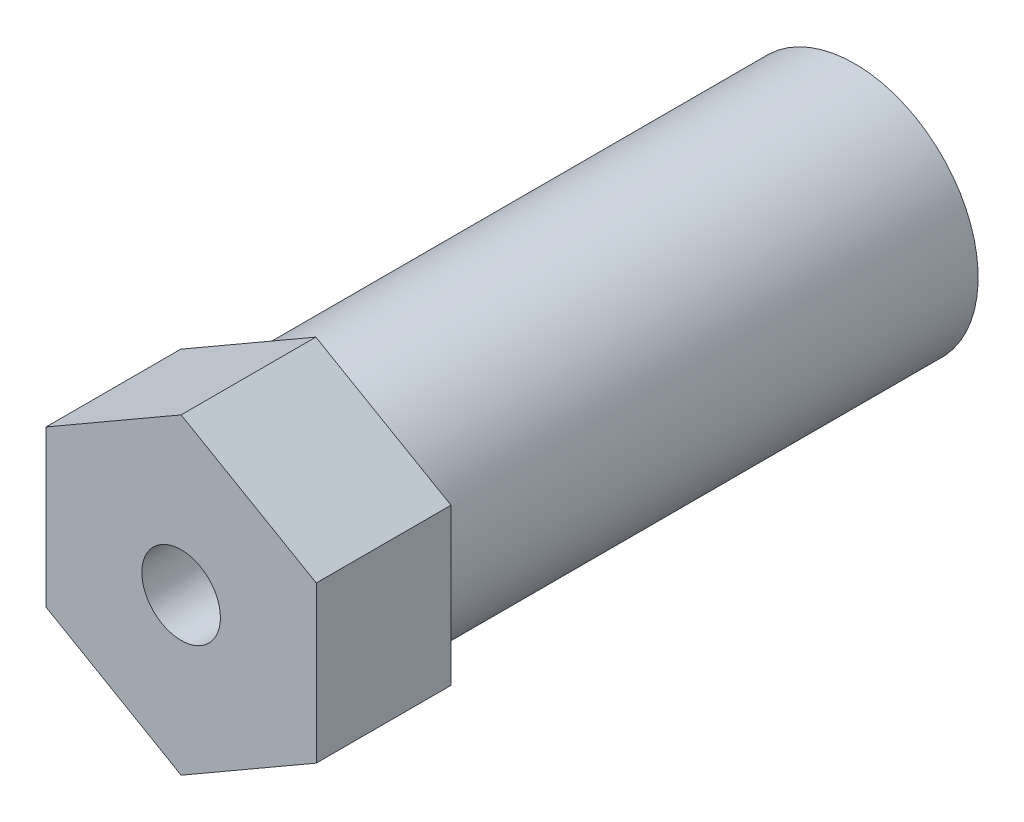
ISO-10303-21;
HEADER;
FILE_DESCRIPTION(('STEP AP214'),'2;1');
FILE_NAME('part.step','',(''),(''),'','','');
FILE_SCHEMA(('AUTOMOTIVE_DESIGN { 1 0 10303 214 1 1 1 1 }'));
ENDSEC;
DATA;
#1=APPLICATION_CONTEXT('core data for automotive mechanical design processes');
#2=APPLICATION_PROTOCOL_DEFINITION('international standard','automotive_design',2000,#1);
#3=PRODUCT_CONTEXT('',#1,'mechanical');
#4=PRODUCT('Part','Part','',(#3));
#5=PRODUCT_RELATED_PRODUCT_CATEGORY('part','',(#4));
#6=PRODUCT_DEFINITION_FORMATION('','',#4);
#7=PRODUCT_DEFINITION_CONTEXT('part definition',#1,'design');
#8=PRODUCT_DEFINITION('design','',#6,#7);
#9=PRODUCT_DEFINITION_SHAPE('','',#8);
#10=(LENGTH_UNIT() NAMED_UNIT(*) SI_UNIT(.MILLI.,.METRE.));
#11=(NAMED_UNIT(*) PLANE_ANGLE_UNIT() SI_UNIT($,.RADIAN.));
#12=(NAMED_UNIT(*) SI_UNIT($,.STERADIAN.) SOLID_ANGLE_UNIT());
#13=UNCERTAINTY_MEASURE_WITH_UNIT(LENGTH_MEASURE(1.E-05),#10,'distance_accuracy_value','');
#14=(GEOMETRIC_REPRESENTATION_CONTEXT(3) GLOBAL_UNCERTAINTY_ASSIGNED_CONTEXT((#13)) GLOBAL_UNIT_ASSIGNED_CONTEXT((#10,
#11,#12)) REPRESENTATION_CONTEXT('',''));
#15=CARTESIAN_POINT('',(0.,0.,0.));
#16=DIRECTION('',(0.,0.,1.));
#17=DIRECTION('',(1.,0.,0.));
#18=AXIS2_PLACEMENT_3D('',#15,#16,#17);
#19=CARTESIAN_POINT('',(0.,0.,0.));
#20=DIRECTION('',(0.,0.,1.));
#21=DIRECTION('',(1.,0.,0.));
#22=AXIS2_PLACEMENT_3D('',#19,#20,#21);
#23=PLANE('',#22);
#24=CARTESIAN_POINT('',(0.,0.,0.));
#25=DIRECTION('',(0.,0.,1.));
#26=DIRECTION('',(1.,0.,0.));
#27=AXIS2_PLACEMENT_3D('',#24,#25,#26);
#28=CIRCLE('',#27,1.75);
#29=CARTESIAN_POINT('',(1.75,0.,0.));
#30=VERTEX_POINT('',#29);
#31=EDGE_CURVE('E136',#30,#30,#28,.T.);
#32=ORIENTED_EDGE('',*,*,#31,.T.);
#33=EDGE_LOOP('',(#32));
#34=FACE_BOUND('',#33,.T.);
#35=CARTESIAN_POINT('',(0.,0.,0.));
#36=DIRECTION('',(0.,0.,-1.));
#37=DIRECTION('',(-1.,0.,0.));
#38=AXIS2_PLACEMENT_3D('',#35,#36,#37);
#39=CIRCLE('',#38,3.);
#40=CARTESIAN_POINT('',(-3.,0.,0.));
#41=VERTEX_POINT('',#40);
#42=EDGE_CURVE('E186',#41,#41,#39,.T.);
#43=ORIENTED_EDGE('',*,*,#42,.T.);
#44=EDGE_LOOP('',(#43));
#45=FACE_BOUND('',#44,.T.);
#46=ADVANCED_FACE('F39',(#34,#45),#23,.F.);
#47=CARTESIAN_POINT('',(6.01887655630181,3.47500000000007,6.));
#48=DIRECTION('',(-0.499999999999995,-0.866025403784441,0.));
#49=DIRECTION('',(0.866025403784441,-0.499999999999995,0.));
#50=AXIS2_PLACEMENT_3D('',#47,#48,#49);
#51=PLANE('',#50);
#52=DIRECTION('',(-0.866025403784441,0.499999999999995,0.));
#53=VECTOR('',#52,1.);
#54=CARTESIAN_POINT('',(6.01887655630181,3.47500000000007,0.));
#55=LINE('',#54,#53);
#56=CARTESIAN_POINT('',(6.01887655630181,3.47500000000007,0.));
#57=VERTEX_POINT('',#56);
#58=CARTESIAN_POINT('',(0.,6.95,0.));
#59=VERTEX_POINT('',#58);
#60=EDGE_CURVE('E131',#57,#59,#55,.T.);
#61=ORIENTED_EDGE('',*,*,#60,.T.);
#62=DIRECTION('',(0.,0.,-1.));
#63=VECTOR('',#62,1.);
#64=CARTESIAN_POINT('',(0.,6.95,6.));
#65=LINE('',#64,#63);
#66=CARTESIAN_POINT('',(0.,6.95,6.));
#67=VERTEX_POINT('',#66);
#68=EDGE_CURVE('E43',#67,#59,#65,.T.);
#69=ORIENTED_EDGE('',*,*,#68,.F.);
#70=DIRECTION('',(-0.866025403784441,0.499999999999995,0.));
#71=VECTOR('',#70,1.);
#72=CARTESIAN_POINT('',(6.01887655630181,3.47500000000007,6.));
#73=LINE('',#72,#71);
#74=CARTESIAN_POINT('',(6.01887655630181,3.47500000000007,6.));
#75=VERTEX_POINT('',#74);
#76=EDGE_CURVE('E148',#75,#67,#73,.T.);
#77=ORIENTED_EDGE('',*,*,#76,.F.);
#78=DIRECTION('',(0.,0.,-1.));
#79=VECTOR('',#78,1.);
#80=CARTESIAN_POINT('',(6.01887655630181,3.47500000000007,6.));
#81=LINE('',#80,#79);
#82=EDGE_CURVE('E127',#75,#57,#81,.T.);
#83=ORIENTED_EDGE('',*,*,#82,.T.);
#84=EDGE_LOOP('',(#61,#69,#77,#83));
#85=FACE_BOUND('',#84,.T.);
#86=ADVANCED_FACE('F41',(#85),#51,.F.);
#87=CARTESIAN_POINT('',(0.,6.95,6.));
#88=DIRECTION('',(0.500000000000001,-0.866025403784438,0.));
#89=DIRECTION('',(0.866025403784438,0.500000000000001,0.));
#90=AXIS2_PLACEMENT_3D('',#87,#88,#89);
#91=PLANE('',#90);
#92=DIRECTION('',(-0.866025403784438,-0.500000000000001,0.));
#93=VECTOR('',#92,1.);
#94=CARTESIAN_POINT('',(0.,6.95,0.));
#95=LINE('',#94,#93);
#96=CARTESIAN_POINT('',(-6.01887655630186,3.47499999999999,0.));
#97=VERTEX_POINT('',#96);
#98=EDGE_CURVE('E135',#59,#97,#95,.T.);
#99=ORIENTED_EDGE('',*,*,#98,.T.);
#100=DIRECTION('',(0.,0.,-1.));
#101=VECTOR('',#100,1.);
#102=CARTESIAN_POINT('',(-6.01887655630186,3.47499999999999,6.));
#103=LINE('',#102,#101);
#104=CARTESIAN_POINT('',(-6.01887655630186,3.47499999999999,6.));
#105=VERTEX_POINT('',#104);
#106=EDGE_CURVE('E154',#105,#97,#103,.T.);
#107=ORIENTED_EDGE('',*,*,#106,.F.);
#108=DIRECTION('',(-0.866025403784438,-0.500000000000001,0.));
#109=VECTOR('',#108,1.);
#110=CARTESIAN_POINT('',(0.,6.95,6.));
#111=LINE('',#110,#109);
#112=EDGE_CURVE('E96',#67,#105,#111,.T.);
#113=ORIENTED_EDGE('',*,*,#112,.F.);
#114=ORIENTED_EDGE('',*,*,#68,.T.);
#115=EDGE_LOOP('',(#99,#107,#113,#114));
#116=FACE_BOUND('',#115,.T.);
#117=ADVANCED_FACE('F161',(#116),#91,.F.);
#118=CARTESIAN_POINT('',(-6.01887655630186,3.47499999999999,6.));
#119=DIRECTION('',(1.,0.,0.));
#120=DIRECTION('',(0.,1.,0.));
#121=AXIS2_PLACEMENT_3D('',#118,#119,#120);
#122=PLANE('',#121);
#123=DIRECTION('',(0.,-1.,0.));
#124=VECTOR('',#123,1.);
#125=CARTESIAN_POINT('',(-6.01887655630186,3.47499999999999,0.));
#126=LINE('',#125,#124);
#127=CARTESIAN_POINT('',(-6.01887655630183,-3.47500000000003,0.));
#128=VERTEX_POINT('',#127);
#129=EDGE_CURVE('E139',#97,#128,#126,.T.);
#130=ORIENTED_EDGE('',*,*,#129,.T.);
#131=DIRECTION('',(0.,0.,-1.));
#132=VECTOR('',#131,1.);
#133=CARTESIAN_POINT('',(-6.01887655630183,-3.47500000000003,6.));
#134=LINE('',#133,#132);
#135=CARTESIAN_POINT('',(-6.01887655630183,-3.47500000000003,6.));
#136=VERTEX_POINT('',#135);
#137=EDGE_CURVE('E120',#136,#128,#134,.T.);
#138=ORIENTED_EDGE('',*,*,#137,.F.);
#139=DIRECTION('',(0.,-1.,0.));
#140=VECTOR('',#139,1.);
#141=CARTESIAN_POINT('',(-6.01887655630186,3.47499999999999,6.));
#142=LINE('',#141,#140);
#143=EDGE_CURVE('E109',#105,#136,#142,.T.);
#144=ORIENTED_EDGE('',*,*,#143,.F.);
#145=ORIENTED_EDGE('',*,*,#106,.T.);
#146=EDGE_LOOP('',(#130,#138,#144,#145));
#147=FACE_BOUND('',#146,.T.);
#148=ADVANCED_FACE('F167',(#147),#122,.F.);
#149=CARTESIAN_POINT('',(-6.01887655630183,-3.47500000000003,6.));
#150=DIRECTION('',(0.499999999999995,0.866025403784441,0.));
#151=DIRECTION('',(-0.866025403784442,0.499999999999995,0.));
#152=AXIS2_PLACEMENT_3D('',#149,#150,#151);
#153=PLANE('',#152);
#154=DIRECTION('',(0.866025403784442,-0.499999999999995,0.));
#155=VECTOR('',#154,1.);
#156=CARTESIAN_POINT('',(-6.01887655630183,-3.47500000000003,0.));
#157=LINE('',#156,#155);
#158=CARTESIAN_POINT('',(0.,-6.95,0.));
#159=VERTEX_POINT('',#158);
#160=EDGE_CURVE('E118',#128,#159,#157,.T.);
#161=ORIENTED_EDGE('',*,*,#160,.T.);
#162=DIRECTION('',(0.,0.,-1.));
#163=VECTOR('',#162,1.);
#164=CARTESIAN_POINT('',(0.,-6.95,6.));
#165=LINE('',#164,#163);
#166=CARTESIAN_POINT('',(0.,-6.95,6.));
#167=VERTEX_POINT('',#166);
#168=EDGE_CURVE('E115',#167,#159,#165,.T.);
#169=ORIENTED_EDGE('',*,*,#168,.F.);
#170=DIRECTION('',(0.866025403784442,-0.499999999999995,0.));
#171=VECTOR('',#170,1.);
#172=CARTESIAN_POINT('',(-6.01887655630183,-3.47500000000003,6.));
#173=LINE('',#172,#171);
#174=EDGE_CURVE('E103',#136,#167,#173,.T.);
#175=ORIENTED_EDGE('',*,*,#174,.F.);
#176=ORIENTED_EDGE('',*,*,#137,.T.);
#177=EDGE_LOOP('',(#161,#169,#175,#176));
#178=FACE_BOUND('',#177,.T.);
#179=ADVANCED_FACE('F116',(#178),#153,.F.);
#180=CARTESIAN_POINT('',(0.,-6.95,6.));
#181=DIRECTION('',(-0.500000000000007,0.866025403784434,0.));
#182=DIRECTION('',(-0.866025403784435,-0.500000000000007,0.));
#183=AXIS2_PLACEMENT_3D('',#180,#181,#182);
#184=PLANE('',#183);
#185=DIRECTION('',(0.866025403784435,0.500000000000007,0.));
#186=VECTOR('',#185,1.);
#187=CARTESIAN_POINT('',(0.,-6.95,0.));
#188=LINE('',#187,#186);
#189=CARTESIAN_POINT('',(6.01887655630188,-3.47499999999994,0.));
#190=VERTEX_POINT('',#189);
#191=EDGE_CURVE('E81',#159,#190,#188,.T.);
#192=ORIENTED_EDGE('',*,*,#191,.T.);
#193=DIRECTION('',(0.,0.,-1.));
#194=VECTOR('',#193,1.);
#195=CARTESIAN_POINT('',(6.01887655630188,-3.47499999999994,6.));
#196=LINE('',#195,#194);
#197=CARTESIAN_POINT('',(6.01887655630188,-3.47499999999994,6.));
#198=VERTEX_POINT('',#197);
#199=EDGE_CURVE('E121',#198,#190,#196,.T.);
#200=ORIENTED_EDGE('',*,*,#199,.F.);
#201=DIRECTION('',(0.866025403784435,0.500000000000007,0.));
#202=VECTOR('',#201,1.);
#203=CARTESIAN_POINT('',(0.,-6.95,6.));
#204=LINE('',#203,#202);
#205=EDGE_CURVE('E107',#167,#198,#204,.T.);
#206=ORIENTED_EDGE('',*,*,#205,.F.);
#207=ORIENTED_EDGE('',*,*,#168,.T.);
#208=EDGE_LOOP('',(#192,#200,#206,#207));
#209=FACE_BOUND('',#208,.T.);
#210=ADVANCED_FACE('F123',(#209),#184,.F.);
#211=CARTESIAN_POINT('',(6.01887655630188,-3.47499999999994,6.));
#212=DIRECTION('',(-1.,0.,0.));
#213=DIRECTION('',(0.,-1.,0.));
#214=AXIS2_PLACEMENT_3D('',#211,#212,#213);
#215=PLANE('',#214);
#216=DIRECTION('',(0.,1.,0.));
#217=VECTOR('',#216,1.);
#218=CARTESIAN_POINT('',(6.01887655630188,-3.47499999999994,0.));
#219=LINE('',#218,#217);
#220=EDGE_CURVE('E87',#190,#57,#219,.T.);
#221=ORIENTED_EDGE('',*,*,#220,.T.);
#222=ORIENTED_EDGE('',*,*,#82,.F.);
#223=DIRECTION('',(0.,1.,0.));
#224=VECTOR('',#223,1.);
#225=CARTESIAN_POINT('',(6.01887655630188,-3.47499999999994,6.));
#226=LINE('',#225,#224);
#227=EDGE_CURVE('E58',#198,#75,#226,.T.);
#228=ORIENTED_EDGE('',*,*,#227,.F.);
#229=ORIENTED_EDGE('',*,*,#199,.T.);
#230=EDGE_LOOP('',(#221,#222,#228,#229));
#231=FACE_BOUND('',#230,.T.);
#232=ADVANCED_FACE('F226',(#231),#215,.F.);
#233=CARTESIAN_POINT('',(0.,0.,6.));
#234=DIRECTION('',(0.,0.,1.));
#235=DIRECTION('',(1.,0.,0.));
#236=AXIS2_PLACEMENT_3D('',#233,#234,#235);
#237=PLANE('',#236);
#238=CARTESIAN_POINT('',(0.,0.,6.));
#239=DIRECTION('',(0.,0.,1.));
#240=DIRECTION('',(1.,0.,0.));
#241=AXIS2_PLACEMENT_3D('',#238,#239,#240);
#242=CIRCLE('',#241,1.75);
#243=CARTESIAN_POINT('',(1.75,0.,6.));
#244=VERTEX_POINT('',#243);
#245=EDGE_CURVE('E174',#244,#244,#242,.T.);
#246=ORIENTED_EDGE('',*,*,#245,.F.);
#247=EDGE_LOOP('',(#246));
#248=FACE_BOUND('',#247,.T.);
#249=ORIENTED_EDGE('',*,*,#76,.T.);
#250=ORIENTED_EDGE('',*,*,#112,.T.);
#251=ORIENTED_EDGE('',*,*,#143,.T.);
#252=ORIENTED_EDGE('',*,*,#174,.T.);
#253=ORIENTED_EDGE('',*,*,#205,.T.);
#254=ORIENTED_EDGE('',*,*,#227,.T.);
#255=EDGE_LOOP('',(#249,#250,#251,#252,#253,#254));
#256=FACE_BOUND('',#255,.T.);
#257=ADVANCED_FACE('F105',(#248,#256),#237,.T.);
#258=CARTESIAN_POINT('',(0.,0.,0.));
#259=DIRECTION('',(0.,0.,-1.));
#260=DIRECTION('',(-1.,0.,0.));
#261=AXIS2_PLACEMENT_3D('',#258,#259,#260);
#262=CIRCLE('',#261,5.5);
#263=CARTESIAN_POINT('',(-5.5,0.,0.));
#264=VERTEX_POINT('',#263);
#265=EDGE_CURVE('E11',#264,#264,#262,.T.);
#266=ORIENTED_EDGE('',*,*,#265,.F.);
#267=EDGE_LOOP('',(#266));
#268=FACE_BOUND('',#267,.T.);
#269=ORIENTED_EDGE('',*,*,#60,.F.);
#270=ORIENTED_EDGE('',*,*,#220,.F.);
#271=ORIENTED_EDGE('',*,*,#191,.F.);
#272=ORIENTED_EDGE('',*,*,#160,.F.);
#273=ORIENTED_EDGE('',*,*,#129,.F.);
#274=ORIENTED_EDGE('',*,*,#98,.F.);
#275=EDGE_LOOP('',(#269,#270,#271,#272,#273,#274));
#276=FACE_BOUND('',#275,.T.);
#277=ADVANCED_FACE('F166',(#268,#276),#23,.F.);
#278=CARTESIAN_POINT('',(0.,0.,0.));
#279=DIRECTION('',(0.,0.,1.));
#280=DIRECTION('',(1.,0.,0.));
#281=AXIS2_PLACEMENT_3D('',#278,#279,#280);
#282=CYLINDRICAL_SURFACE('',#281,1.75);
#283=ORIENTED_EDGE('',*,*,#31,.F.);
#284=EDGE_LOOP('',(#283));
#285=FACE_BOUND('',#284,.T.);
#286=ORIENTED_EDGE('',*,*,#245,.T.);
#287=EDGE_LOOP('',(#286));
#288=FACE_BOUND('',#287,.T.);
#289=ADVANCED_FACE('F200',(#285,#288),#282,.F.);
#290=CARTESIAN_POINT('',(0.,0.,-24.));
#291=DIRECTION('',(0.,0.,-1.));
#292=DIRECTION('',(-1.,0.,0.));
#293=AXIS2_PLACEMENT_3D('',#290,#291,#292);
#294=PLANE('',#293);
#295=CARTESIAN_POINT('',(0.,0.,-24.));
#296=DIRECTION('',(0.,0.,-1.));
#297=DIRECTION('',(-1.,0.,0.));
#298=AXIS2_PLACEMENT_3D('',#295,#296,#297);
#299=CIRCLE('',#298,5.5);
#300=CARTESIAN_POINT('',(-5.5,0.,-24.));
#301=VERTEX_POINT('',#300);
#302=EDGE_CURVE('E178',#301,#301,#299,.T.);
#303=ORIENTED_EDGE('',*,*,#302,.T.);
#304=EDGE_LOOP('',(#303));
#305=FACE_BOUND('',#304,.T.);
#306=CARTESIAN_POINT('',(0.,0.,-24.));
#307=DIRECTION('',(0.,0.,-1.));
#308=DIRECTION('',(-1.,0.,0.));
#309=AXIS2_PLACEMENT_3D('',#306,#307,#308);
#310=CIRCLE('',#309,3.);
#311=CARTESIAN_POINT('',(-3.,0.,-24.));
#312=VERTEX_POINT('',#311);
#313=EDGE_CURVE('E185',#312,#312,#310,.T.);
#314=ORIENTED_EDGE('',*,*,#313,.F.);
#315=EDGE_LOOP('',(#314));
#316=FACE_BOUND('',#315,.T.);
#317=ADVANCED_FACE('F197',(#305,#316),#294,.T.);
#318=CARTESIAN_POINT('',(0.,0.,-24.));
#319=DIRECTION('',(0.,0.,1.));
#320=DIRECTION('',(1.,0.,0.));
#321=AXIS2_PLACEMENT_3D('',#318,#319,#320);
#322=CYLINDRICAL_SURFACE('',#321,5.5);
#323=ORIENTED_EDGE('',*,*,#302,.F.);
#324=EDGE_LOOP('',(#323));
#325=FACE_BOUND('',#324,.T.);
#326=ORIENTED_EDGE('',*,*,#265,.T.);
#327=EDGE_LOOP('',(#326));
#328=FACE_BOUND('',#327,.T.);
#329=ADVANCED_FACE('F199',(#325,#328),#322,.T.);
#330=CARTESIAN_POINT('',(0.,0.,-24.));
#331=DIRECTION('',(0.,0.,1.));
#332=DIRECTION('',(1.,0.,0.));
#333=AXIS2_PLACEMENT_3D('',#330,#331,#332);
#334=CYLINDRICAL_SURFACE('',#333,3.);
#335=ORIENTED_EDGE('',*,*,#313,.T.);
#336=EDGE_LOOP('',(#335));
#337=FACE_BOUND('',#336,.T.);
#338=ORIENTED_EDGE('',*,*,#42,.F.);
#339=EDGE_LOOP('',(#338));
#340=FACE_BOUND('',#339,.T.);
#341=ADVANCED_FACE('F194',(#337,#340),#334,.F.);
#342=CLOSED_SHELL('',(#46,#86,#117,#148,#179,#210,#232,#257,#277,#289,#317,#329,#341));
#343=MANIFOLD_SOLID_BREP('B2',#342);
#344=ADVANCED_BREP_SHAPE_REPRESENTATION('',(#18,#343),#14);
#345=SHAPE_DEFINITION_REPRESENTATION(#9,#344);
ENDSEC;
END-ISO-10303-21;
